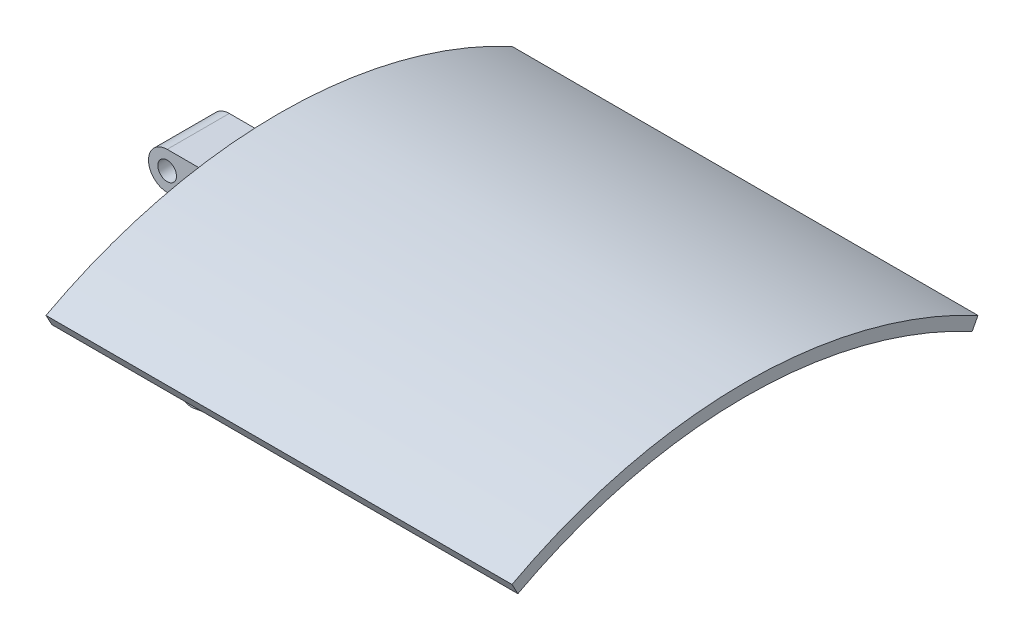
ISO-10303-21;
HEADER;
FILE_DESCRIPTION(('STEP AP214'),'2;1');
FILE_NAME('part.step','',(''),(''),'','','');
FILE_SCHEMA(('AUTOMOTIVE_DESIGN { 1 0 10303 214 1 1 1 1 }'));
ENDSEC;
DATA;
#1=APPLICATION_CONTEXT('core data for automotive mechanical design processes');
#2=APPLICATION_PROTOCOL_DEFINITION('international standard','automotive_design',2000,#1);
#3=PRODUCT_CONTEXT('',#1,'mechanical');
#4=PRODUCT('Part','Part','',(#3));
#5=PRODUCT_RELATED_PRODUCT_CATEGORY('part','',(#4));
#6=PRODUCT_DEFINITION_FORMATION('','',#4);
#7=PRODUCT_DEFINITION_CONTEXT('part definition',#1,'design');
#8=PRODUCT_DEFINITION('design','',#6,#7);
#9=PRODUCT_DEFINITION_SHAPE('','',#8);
#10=(LENGTH_UNIT() NAMED_UNIT(*) SI_UNIT(.MILLI.,.METRE.));
#11=(NAMED_UNIT(*) PLANE_ANGLE_UNIT() SI_UNIT($,.RADIAN.));
#12=(NAMED_UNIT(*) SI_UNIT($,.STERADIAN.) SOLID_ANGLE_UNIT());
#13=UNCERTAINTY_MEASURE_WITH_UNIT(LENGTH_MEASURE(1.E-05),#10,'distance_accuracy_value','');
#14=(GEOMETRIC_REPRESENTATION_CONTEXT(3) GLOBAL_UNCERTAINTY_ASSIGNED_CONTEXT((#13)) GLOBAL_UNIT_ASSIGNED_CONTEXT((#10,
#11,#12)) REPRESENTATION_CONTEXT('',''));
#15=CARTESIAN_POINT('',(0.,0.,0.));
#16=DIRECTION('',(0.,0.,1.));
#17=DIRECTION('',(1.,0.,0.));
#18=AXIS2_PLACEMENT_3D('',#15,#16,#17);
#19=CARTESIAN_POINT('',(75.,0.,0.));
#20=DIRECTION('',(-1.,0.,0.));
#21=DIRECTION('',(0.,0.,1.));
#22=AXIS2_PLACEMENT_3D('',#19,#20,#21);
#23=CYLINDRICAL_SURFACE('',#22,77.5);
#24=DIRECTION('',(-1.,0.,0.));
#25=VECTOR('',#24,1.);
#26=CARTESIAN_POINT('',(75.,77.3385414912901,-5.));
#27=LINE('',#26,#25);
#28=CARTESIAN_POINT('',(7.,77.3385414912901,-5.));
#29=VERTEX_POINT('',#28);
#30=CARTESIAN_POINT('',(13.,77.3385414912901,-5.));
#31=VERTEX_POINT('',#30);
#32=EDGE_CURVE('E404',#29,#31,#27,.F.);
#33=ORIENTED_EDGE('',*,*,#32,.F.);
#34=CARTESIAN_POINT('',(7.00000000000001,0.,0.));
#35=DIRECTION('',(-1.,0.,0.));
#36=DIRECTION('',(0.,-1.,0.));
#37=AXIS2_PLACEMENT_3D('',#34,#35,#36);
#38=CIRCLE('',#37,77.5);
#39=CARTESIAN_POINT('',(7.,77.3385414912901,5.));
#40=VERTEX_POINT('',#39);
#41=EDGE_CURVE('E401',#29,#40,#38,.F.);
#42=ORIENTED_EDGE('',*,*,#41,.T.);
#43=DIRECTION('',(-1.,0.,0.));
#44=VECTOR('',#43,1.);
#45=CARTESIAN_POINT('',(75.,77.3385414912901,5.));
#46=LINE('',#45,#44);
#47=CARTESIAN_POINT('',(13.,77.3385414912901,5.));
#48=VERTEX_POINT('',#47);
#49=EDGE_CURVE('E396',#40,#48,#46,.F.);
#50=ORIENTED_EDGE('',*,*,#49,.T.);
#51=CARTESIAN_POINT('',(13.,0.,0.));
#52=DIRECTION('',(-1.,0.,0.));
#53=DIRECTION('',(0.,-1.,0.));
#54=AXIS2_PLACEMENT_3D('',#51,#52,#53);
#55=CIRCLE('',#54,77.5);
#56=EDGE_CURVE('E399',#31,#48,#55,.F.);
#57=ORIENTED_EDGE('',*,*,#56,.F.);
#58=EDGE_LOOP('',(#33,#42,#50,#57));
#59=FACE_BOUND('',#58,.T.);
#60=CARTESIAN_POINT('',(0.,0.,0.));
#61=DIRECTION('',(-1.,0.,0.));
#62=DIRECTION('',(0.,0.,1.));
#63=AXIS2_PLACEMENT_3D('',#60,#61,#62);
#64=CIRCLE('',#63,77.5);
#65=CARTESIAN_POINT('',(0.,68.3364084550916,36.5566037735849));
#66=VERTEX_POINT('',#65);
#67=CARTESIAN_POINT('',(0.,68.3364084550916,-36.5566037735849));
#68=VERTEX_POINT('',#67);
#69=EDGE_CURVE('E373',#66,#68,#64,.T.);
#70=ORIENTED_EDGE('',*,*,#69,.T.);
#71=DIRECTION('',(-1.,0.,0.));
#72=VECTOR('',#71,1.);
#73=CARTESIAN_POINT('',(75.,68.3364084550916,-36.5566037735849));
#74=LINE('',#73,#72);
#75=CARTESIAN_POINT('',(75.,68.3364084550916,-36.5566037735849));
#76=VERTEX_POINT('',#75);
#77=EDGE_CURVE('E381',#76,#68,#74,.T.);
#78=ORIENTED_EDGE('',*,*,#77,.F.);
#79=CARTESIAN_POINT('',(75.,0.,0.));
#80=DIRECTION('',(-1.,0.,0.));
#81=DIRECTION('',(0.,0.,1.));
#82=AXIS2_PLACEMENT_3D('',#79,#80,#81);
#83=CIRCLE('',#82,77.5);
#84=CARTESIAN_POINT('',(75.,68.3364084550916,36.5566037735849));
#85=VERTEX_POINT('',#84);
#86=EDGE_CURVE('E380',#85,#76,#83,.T.);
#87=ORIENTED_EDGE('',*,*,#86,.F.);
#88=DIRECTION('',(-1.,0.,0.));
#89=VECTOR('',#88,1.);
#90=CARTESIAN_POINT('',(75.,68.3364084550916,36.5566037735849));
#91=LINE('',#90,#89);
#92=EDGE_CURVE('E366',#85,#66,#91,.T.);
#93=ORIENTED_EDGE('',*,*,#92,.T.);
#94=EDGE_LOOP('',(#70,#78,#87,#93));
#95=FACE_BOUND('',#94,.T.);
#96=DIRECTION('',(-1.,0.,0.));
#97=VECTOR('',#96,1.);
#98=CARTESIAN_POINT('',(75.,77.4419137160233,-3.));
#99=LINE('',#98,#97);
#100=CARTESIAN_POINT('',(30.7213595499958,77.4419137160233,-3.));
#101=VERTEX_POINT('',#100);
#102=CARTESIAN_POINT('',(36.7213595499958,77.4419137160233,-3.));
#103=VERTEX_POINT('',#102);
#104=EDGE_CURVE('E12',#101,#103,#99,.F.);
#105=ORIENTED_EDGE('',*,*,#104,.F.);
#106=CARTESIAN_POINT('',(30.7213595499957,0.,0.));
#107=DIRECTION('',(-1.,0.,0.));
#108=DIRECTION('',(0.,-1.,0.));
#109=AXIS2_PLACEMENT_3D('',#106,#107,#108);
#110=CIRCLE('',#109,77.5);
#111=CARTESIAN_POINT('',(30.7213595499958,77.4419137160233,3.));
#112=VERTEX_POINT('',#111);
#113=EDGE_CURVE('E145',#101,#112,#110,.F.);
#114=ORIENTED_EDGE('',*,*,#113,.T.);
#115=DIRECTION('',(-1.,0.,0.));
#116=VECTOR('',#115,1.);
#117=CARTESIAN_POINT('',(75.,77.4419137160233,3.));
#118=LINE('',#117,#116);
#119=CARTESIAN_POINT('',(36.7213595499958,77.4419137160233,3.));
#120=VERTEX_POINT('',#119);
#121=EDGE_CURVE('E407',#112,#120,#118,.F.);
#122=ORIENTED_EDGE('',*,*,#121,.T.);
#123=CARTESIAN_POINT('',(36.721359549996,0.,0.));
#124=DIRECTION('',(1.,0.,0.));
#125=DIRECTION('',(0.,1.,0.));
#126=AXIS2_PLACEMENT_3D('',#123,#124,#125);
#127=CIRCLE('',#126,77.5);
#128=EDGE_CURVE('E410',#120,#103,#127,.F.);
#129=ORIENTED_EDGE('',*,*,#128,.T.);
#130=EDGE_LOOP('',(#105,#114,#122,#129));
#131=FACE_BOUND('',#130,.T.);
#132=ADVANCED_FACE('F137',(#59,#95,#131),#23,.F.);
#133=CARTESIAN_POINT('',(75.,0.,0.));
#134=DIRECTION('',(-1.,0.,0.));
#135=DIRECTION('',(0.,0.,1.));
#136=AXIS2_PLACEMENT_3D('',#133,#134,#135);
#137=CYLINDRICAL_SURFACE('',#136,79.5);
#138=CARTESIAN_POINT('',(0.,0.,0.));
#139=DIRECTION('',(1.,0.,0.));
#140=DIRECTION('',(0.,0.,1.));
#141=AXIS2_PLACEMENT_3D('',#138,#139,#140);
#142=CIRCLE('',#141,79.5);
#143=CARTESIAN_POINT('',(0.,70.0999286732875,-37.5));
#144=VERTEX_POINT('',#143);
#145=CARTESIAN_POINT('',(0.,70.0999286732875,37.5));
#146=VERTEX_POINT('',#145);
#147=EDGE_CURVE('E374',#144,#146,#142,.T.);
#148=ORIENTED_EDGE('',*,*,#147,.T.);
#149=DIRECTION('',(-1.,0.,0.));
#150=VECTOR('',#149,1.);
#151=CARTESIAN_POINT('',(75.,70.0999286732875,37.5));
#152=LINE('',#151,#150);
#153=CARTESIAN_POINT('',(75.,70.0999286732875,37.5));
#154=VERTEX_POINT('',#153);
#155=EDGE_CURVE('E369',#154,#146,#152,.T.);
#156=ORIENTED_EDGE('',*,*,#155,.F.);
#157=CARTESIAN_POINT('',(75.,0.,0.));
#158=DIRECTION('',(1.,0.,0.));
#159=DIRECTION('',(0.,0.,1.));
#160=AXIS2_PLACEMENT_3D('',#157,#158,#159);
#161=CIRCLE('',#160,79.5);
#162=CARTESIAN_POINT('',(75.,70.0999286732875,-37.5));
#163=VERTEX_POINT('',#162);
#164=EDGE_CURVE('E386',#163,#154,#161,.T.);
#165=ORIENTED_EDGE('',*,*,#164,.F.);
#166=DIRECTION('',(-1.,0.,0.));
#167=VECTOR('',#166,1.);
#168=CARTESIAN_POINT('',(75.,70.0999286732875,-37.5));
#169=LINE('',#168,#167);
#170=EDGE_CURVE('E390',#163,#144,#169,.T.);
#171=ORIENTED_EDGE('',*,*,#170,.T.);
#172=EDGE_LOOP('',(#148,#156,#165,#171));
#173=FACE_BOUND('',#172,.T.);
#174=ADVANCED_FACE('F139',(#173),#137,.T.);
#175=CARTESIAN_POINT('',(75.,70.0999286732875,37.5));
#176=DIRECTION('',(0.,0.471698113207548,-0.881760109097956));
#177=DIRECTION('',(0.,0.881760109097956,0.471698113207548));
#178=AXIS2_PLACEMENT_3D('',#175,#176,#177);
#179=PLANE('',#178);
#180=DIRECTION('',(0.,-0.881760109097956,-0.471698113207548));
#181=VECTOR('',#180,1.);
#182=CARTESIAN_POINT('',(0.,70.0999286732875,37.5));
#183=LINE('',#182,#181);
#184=EDGE_CURVE('E364',#146,#66,#183,.T.);
#185=ORIENTED_EDGE('',*,*,#184,.T.);
#186=ORIENTED_EDGE('',*,*,#92,.F.);
#187=DIRECTION('',(0.,-0.881760109097956,-0.471698113207548));
#188=VECTOR('',#187,1.);
#189=CARTESIAN_POINT('',(75.,70.0999286732875,37.5));
#190=LINE('',#189,#188);
#191=EDGE_CURVE('E478',#154,#85,#190,.T.);
#192=ORIENTED_EDGE('',*,*,#191,.F.);
#193=ORIENTED_EDGE('',*,*,#155,.T.);
#194=EDGE_LOOP('',(#185,#186,#192,#193));
#195=FACE_BOUND('',#194,.T.);
#196=ADVANCED_FACE('F352',(#195),#179,.F.);
#197=CARTESIAN_POINT('',(75.,70.0999286732875,-37.5));
#198=DIRECTION('',(0.,0.471698113207551,0.881760109097955));
#199=DIRECTION('',(0.,-0.881760109097955,0.471698113207551));
#200=AXIS2_PLACEMENT_3D('',#197,#198,#199);
#201=PLANE('',#200);
#202=DIRECTION('',(0.,0.881760109097955,-0.471698113207551));
#203=VECTOR('',#202,1.);
#204=CARTESIAN_POINT('',(0.,70.0999286732875,-37.5));
#205=LINE('',#204,#203);
#206=EDGE_CURVE('E384',#68,#144,#205,.T.);
#207=ORIENTED_EDGE('',*,*,#206,.T.);
#208=ORIENTED_EDGE('',*,*,#170,.F.);
#209=DIRECTION('',(0.,0.881760109097955,-0.471698113207551));
#210=VECTOR('',#209,1.);
#211=CARTESIAN_POINT('',(75.,70.0999286732875,-37.5));
#212=LINE('',#211,#210);
#213=EDGE_CURVE('E393',#76,#163,#212,.T.);
#214=ORIENTED_EDGE('',*,*,#213,.F.);
#215=ORIENTED_EDGE('',*,*,#77,.T.);
#216=EDGE_LOOP('',(#207,#208,#214,#215));
#217=FACE_BOUND('',#216,.T.);
#218=ADVANCED_FACE('F345',(#217),#201,.F.);
#219=CARTESIAN_POINT('',(75.,0.,0.));
#220=DIRECTION('',(-1.,0.,0.));
#221=DIRECTION('',(0.,0.,1.));
#222=AXIS2_PLACEMENT_3D('',#219,#220,#221);
#223=PLANE('',#222);
#224=ORIENTED_EDGE('',*,*,#164,.T.);
#225=ORIENTED_EDGE('',*,*,#191,.T.);
#226=ORIENTED_EDGE('',*,*,#86,.T.);
#227=ORIENTED_EDGE('',*,*,#213,.T.);
#228=EDGE_LOOP('',(#224,#225,#226,#227));
#229=FACE_BOUND('',#228,.T.);
#230=ADVANCED_FACE('F342',(#229),#223,.F.);
#231=CARTESIAN_POINT('',(0.,0.,0.));
#232=DIRECTION('',(-1.,0.,0.));
#233=DIRECTION('',(0.,0.,1.));
#234=AXIS2_PLACEMENT_3D('',#231,#232,#233);
#235=PLANE('',#234);
#236=ORIENTED_EDGE('',*,*,#147,.F.);
#237=ORIENTED_EDGE('',*,*,#206,.F.);
#238=ORIENTED_EDGE('',*,*,#69,.F.);
#239=ORIENTED_EDGE('',*,*,#184,.F.);
#240=EDGE_LOOP('',(#236,#237,#238,#239));
#241=FACE_BOUND('',#240,.T.);
#242=ADVANCED_FACE('F331',(#241),#235,.T.);
#243=CARTESIAN_POINT('',(7.,77.5,-5.));
#244=DIRECTION('',(-1.,0.,0.));
#245=DIRECTION('',(0.,-1.,0.));
#246=AXIS2_PLACEMENT_3D('',#243,#244,#245);
#247=PLANE('',#246);
#248=ORIENTED_EDGE('',*,*,#41,.F.);
#249=DIRECTION('',(0.,-1.,0.));
#250=VECTOR('',#249,1.);
#251=CARTESIAN_POINT('',(7.,77.5,-5.));
#252=LINE('',#251,#250);
#253=CARTESIAN_POINT('',(7.,70.5,-5.));
#254=VERTEX_POINT('',#253);
#255=EDGE_CURVE('E461',#29,#254,#252,.T.);
#256=ORIENTED_EDGE('',*,*,#255,.T.);
#257=DIRECTION('',(0.,0.,1.));
#258=VECTOR('',#257,1.);
#259=CARTESIAN_POINT('',(7.,70.5,-5.));
#260=LINE('',#259,#258);
#261=CARTESIAN_POINT('',(7.,70.5,5.));
#262=VERTEX_POINT('',#261);
#263=EDGE_CURVE('E469',#254,#262,#260,.T.);
#264=ORIENTED_EDGE('',*,*,#263,.T.);
#265=DIRECTION('',(0.,-1.,0.));
#266=VECTOR('',#265,1.);
#267=CARTESIAN_POINT('',(7.,77.5,5.));
#268=LINE('',#267,#266);
#269=EDGE_CURVE('E446',#40,#262,#268,.T.);
#270=ORIENTED_EDGE('',*,*,#269,.F.);
#271=EDGE_LOOP('',(#248,#256,#264,#270));
#272=FACE_BOUND('',#271,.T.);
#273=ADVANCED_FACE('F328',(#272),#247,.T.);
#274=CARTESIAN_POINT('',(13.,77.5,-5.));
#275=DIRECTION('',(-1.,0.,0.));
#276=DIRECTION('',(0.,-1.,0.));
#277=AXIS2_PLACEMENT_3D('',#274,#275,#276);
#278=PLANE('',#277);
#279=DIRECTION('',(0.,-1.,0.));
#280=VECTOR('',#279,1.);
#281=CARTESIAN_POINT('',(13.,77.5,-5.));
#282=LINE('',#281,#280);
#283=CARTESIAN_POINT('',(13.,64.5,-5.));
#284=VERTEX_POINT('',#283);
#285=EDGE_CURVE('E459',#31,#284,#282,.T.);
#286=ORIENTED_EDGE('',*,*,#285,.F.);
#287=ORIENTED_EDGE('',*,*,#56,.T.);
#288=DIRECTION('',(0.,-1.,0.));
#289=VECTOR('',#288,1.);
#290=CARTESIAN_POINT('',(13.,77.5,5.));
#291=LINE('',#290,#289);
#292=CARTESIAN_POINT('',(13.,64.5,5.));
#293=VERTEX_POINT('',#292);
#294=EDGE_CURVE('E160',#48,#293,#291,.T.);
#295=ORIENTED_EDGE('',*,*,#294,.T.);
#296=DIRECTION('',(0.,0.,1.));
#297=VECTOR('',#296,1.);
#298=CARTESIAN_POINT('',(13.,64.5,-5.));
#299=LINE('',#298,#297);
#300=EDGE_CURVE('E472',#284,#293,#299,.T.);
#301=ORIENTED_EDGE('',*,*,#300,.F.);
#302=EDGE_LOOP('',(#286,#287,#295,#301));
#303=FACE_BOUND('',#302,.T.);
#304=ADVANCED_FACE('F322',(#303),#278,.F.);
#305=CARTESIAN_POINT('',(-13.,67.5,-5.));
#306=DIRECTION('',(0.,0.,1.));
#307=DIRECTION('',(1.,0.,0.));
#308=AXIS2_PLACEMENT_3D('',#305,#306,#307);
#309=PLANE('',#308);
#310=CARTESIAN_POINT('',(-13.,67.5,-5.));
#311=DIRECTION('',(0.,0.,1.));
#312=DIRECTION('',(1.,0.,0.));
#313=AXIS2_PLACEMENT_3D('',#310,#311,#312);
#314=CIRCLE('',#313,1.5);
#315=CARTESIAN_POINT('',(-11.5,67.5,-5.));
#316=VERTEX_POINT('',#315);
#317=EDGE_CURVE('E451',#316,#316,#314,.T.);
#318=ORIENTED_EDGE('',*,*,#317,.T.);
#319=EDGE_LOOP('',(#318));
#320=FACE_BOUND('',#319,.T.);
#321=ORIENTED_EDGE('',*,*,#255,.F.);
#322=ORIENTED_EDGE('',*,*,#32,.T.);
#323=ORIENTED_EDGE('',*,*,#285,.T.);
#324=DIRECTION('',(-1.,0.,0.));
#325=VECTOR('',#324,1.);
#326=CARTESIAN_POINT('',(13.,64.5,-5.));
#327=LINE('',#326,#325);
#328=CARTESIAN_POINT('',(-13.,64.5,-5.));
#329=VERTEX_POINT('',#328);
#330=EDGE_CURVE('E457',#284,#329,#327,.T.);
#331=ORIENTED_EDGE('',*,*,#330,.T.);
#332=CARTESIAN_POINT('',(-13.,67.5,-5.));
#333=DIRECTION('',(0.,0.,1.));
#334=DIRECTION('',(1.,0.,0.));
#335=AXIS2_PLACEMENT_3D('',#332,#333,#334);
#336=CIRCLE('',#335,3.);
#337=CARTESIAN_POINT('',(-13.,70.5,-5.));
#338=VERTEX_POINT('',#337);
#339=EDGE_CURVE('E454',#338,#329,#336,.T.);
#340=ORIENTED_EDGE('',*,*,#339,.F.);
#341=DIRECTION('',(1.,0.,0.));
#342=VECTOR('',#341,1.);
#343=CARTESIAN_POINT('',(-13.,70.5,-5.));
#344=LINE('',#343,#342);
#345=EDGE_CURVE('E463',#338,#254,#344,.T.);
#346=ORIENTED_EDGE('',*,*,#345,.T.);
#347=EDGE_LOOP('',(#321,#322,#323,#331,#340,#346));
#348=FACE_BOUND('',#347,.T.);
#349=ADVANCED_FACE('F312',(#320,#348),#309,.F.);
#350=CARTESIAN_POINT('',(-13.,67.5,5.));
#351=DIRECTION('',(0.,0.,1.));
#352=DIRECTION('',(1.,0.,0.));
#353=AXIS2_PLACEMENT_3D('',#350,#351,#352);
#354=PLANE('',#353);
#355=CARTESIAN_POINT('',(-13.,67.5,5.));
#356=DIRECTION('',(0.,0.,1.));
#357=DIRECTION('',(1.,0.,0.));
#358=AXIS2_PLACEMENT_3D('',#355,#356,#357);
#359=CIRCLE('',#358,1.5);
#360=CARTESIAN_POINT('',(-11.5,67.5,5.));
#361=VERTEX_POINT('',#360);
#362=EDGE_CURVE('E261',#361,#361,#359,.T.);
#363=ORIENTED_EDGE('',*,*,#362,.F.);
#364=EDGE_LOOP('',(#363));
#365=FACE_BOUND('',#364,.T.);
#366=ORIENTED_EDGE('',*,*,#49,.F.);
#367=ORIENTED_EDGE('',*,*,#269,.T.);
#368=DIRECTION('',(1.,0.,0.));
#369=VECTOR('',#368,1.);
#370=CARTESIAN_POINT('',(-13.,70.5,5.));
#371=LINE('',#370,#369);
#372=CARTESIAN_POINT('',(-13.,70.5,5.));
#373=VERTEX_POINT('',#372);
#374=EDGE_CURVE('E448',#373,#262,#371,.T.);
#375=ORIENTED_EDGE('',*,*,#374,.F.);
#376=CARTESIAN_POINT('',(-13.,67.5,5.));
#377=DIRECTION('',(0.,0.,1.));
#378=DIRECTION('',(1.,0.,0.));
#379=AXIS2_PLACEMENT_3D('',#376,#377,#378);
#380=CIRCLE('',#379,3.);
#381=CARTESIAN_POINT('',(-13.,64.5,5.));
#382=VERTEX_POINT('',#381);
#383=EDGE_CURVE('E439',#373,#382,#380,.T.);
#384=ORIENTED_EDGE('',*,*,#383,.T.);
#385=DIRECTION('',(-1.,0.,0.));
#386=VECTOR('',#385,1.);
#387=CARTESIAN_POINT('',(13.,64.5,5.));
#388=LINE('',#387,#386);
#389=EDGE_CURVE('E442',#293,#382,#388,.T.);
#390=ORIENTED_EDGE('',*,*,#389,.F.);
#391=ORIENTED_EDGE('',*,*,#294,.F.);
#392=EDGE_LOOP('',(#366,#367,#375,#384,#390,#391));
#393=FACE_BOUND('',#392,.T.);
#394=ADVANCED_FACE('F308',(#365,#393),#354,.T.);
#395=CARTESIAN_POINT('',(-13.,67.5,-5.));
#396=DIRECTION('',(0.,0.,1.));
#397=DIRECTION('',(1.,0.,0.));
#398=AXIS2_PLACEMENT_3D('',#395,#396,#397);
#399=CYLINDRICAL_SURFACE('',#398,3.);
#400=DIRECTION('',(0.,0.,1.));
#401=VECTOR('',#400,1.);
#402=CARTESIAN_POINT('',(-13.,64.5,-5.));
#403=LINE('',#402,#401);
#404=EDGE_CURVE('E466',#329,#382,#403,.T.);
#405=ORIENTED_EDGE('',*,*,#404,.T.);
#406=ORIENTED_EDGE('',*,*,#383,.F.);
#407=DIRECTION('',(0.,0.,1.));
#408=VECTOR('',#407,1.);
#409=CARTESIAN_POINT('',(-13.,70.5,-5.));
#410=LINE('',#409,#408);
#411=EDGE_CURVE('E467',#338,#373,#410,.T.);
#412=ORIENTED_EDGE('',*,*,#411,.F.);
#413=ORIENTED_EDGE('',*,*,#339,.T.);
#414=EDGE_LOOP('',(#405,#406,#412,#413));
#415=FACE_BOUND('',#414,.T.);
#416=ADVANCED_FACE('F311',(#415),#399,.T.);
#417=CARTESIAN_POINT('',(-13.,70.5,-5.));
#418=DIRECTION('',(0.,-1.,0.));
#419=DIRECTION('',(0.,0.,-1.));
#420=AXIS2_PLACEMENT_3D('',#417,#418,#419);
#421=PLANE('',#420);
#422=ORIENTED_EDGE('',*,*,#411,.T.);
#423=ORIENTED_EDGE('',*,*,#374,.T.);
#424=ORIENTED_EDGE('',*,*,#263,.F.);
#425=ORIENTED_EDGE('',*,*,#345,.F.);
#426=EDGE_LOOP('',(#422,#423,#424,#425));
#427=FACE_BOUND('',#426,.T.);
#428=ADVANCED_FACE('F324',(#427),#421,.F.);
#429=CARTESIAN_POINT('',(13.,64.5,-5.));
#430=DIRECTION('',(0.,1.,0.));
#431=DIRECTION('',(0.,0.,1.));
#432=AXIS2_PLACEMENT_3D('',#429,#430,#431);
#433=PLANE('',#432);
#434=ORIENTED_EDGE('',*,*,#300,.T.);
#435=ORIENTED_EDGE('',*,*,#389,.T.);
#436=ORIENTED_EDGE('',*,*,#404,.F.);
#437=ORIENTED_EDGE('',*,*,#330,.F.);
#438=EDGE_LOOP('',(#434,#435,#436,#437));
#439=FACE_BOUND('',#438,.T.);
#440=ADVANCED_FACE('F318',(#439),#433,.F.);
#441=CARTESIAN_POINT('',(-13.,67.5,-5.));
#442=DIRECTION('',(0.,0.,1.));
#443=DIRECTION('',(1.,0.,0.));
#444=AXIS2_PLACEMENT_3D('',#441,#442,#443);
#445=CYLINDRICAL_SURFACE('',#444,1.5);
#446=ORIENTED_EDGE('',*,*,#317,.F.);
#447=EDGE_LOOP('',(#446));
#448=FACE_BOUND('',#447,.T.);
#449=ORIENTED_EDGE('',*,*,#362,.T.);
#450=EDGE_LOOP('',(#449));
#451=FACE_BOUND('',#450,.T.);
#452=ADVANCED_FACE('F314',(#448,#451),#445,.F.);
#453=CARTESIAN_POINT('',(30.7213595499958,77.5,-3.));
#454=DIRECTION('',(-1.,0.,0.));
#455=DIRECTION('',(0.,-1.,0.));
#456=AXIS2_PLACEMENT_3D('',#453,#454,#455);
#457=PLANE('',#456);
#458=ORIENTED_EDGE('',*,*,#113,.F.);
#459=DIRECTION('',(0.,-1.,0.));
#460=VECTOR('',#459,1.);
#461=CARTESIAN_POINT('',(30.7213595499958,77.5,-3.));
#462=LINE('',#461,#460);
#463=CARTESIAN_POINT('',(30.7213595499958,72.5,-3.));
#464=VERTEX_POINT('',#463);
#465=EDGE_CURVE('E417',#101,#464,#462,.T.);
#466=ORIENTED_EDGE('',*,*,#465,.T.);
#467=DIRECTION('',(0.,0.,1.));
#468=VECTOR('',#467,1.);
#469=CARTESIAN_POINT('',(30.7213595499958,72.5,-3.));
#470=LINE('',#469,#468);
#471=CARTESIAN_POINT('',(30.7213595499958,72.5,3.));
#472=VERTEX_POINT('',#471);
#473=EDGE_CURVE('E434',#464,#472,#470,.T.);
#474=ORIENTED_EDGE('',*,*,#473,.T.);
#475=DIRECTION('',(0.,-1.,0.));
#476=VECTOR('',#475,1.);
#477=CARTESIAN_POINT('',(30.7213595499958,77.5,3.));
#478=LINE('',#477,#476);
#479=EDGE_CURVE('E285',#112,#472,#478,.T.);
#480=ORIENTED_EDGE('',*,*,#479,.F.);
#481=EDGE_LOOP('',(#458,#466,#474,#480));
#482=FACE_BOUND('',#481,.T.);
#483=ADVANCED_FACE('F317',(#482),#457,.T.);
#484=CARTESIAN_POINT('',(36.7213595499958,72.5,-3.));
#485=DIRECTION('',(1.,0.,0.));
#486=DIRECTION('',(0.,1.,0.));
#487=AXIS2_PLACEMENT_3D('',#484,#485,#486);
#488=PLANE('',#487);
#489=DIRECTION('',(0.,1.,0.));
#490=VECTOR('',#489,1.);
#491=CARTESIAN_POINT('',(36.7213595499958,72.5,-3.));
#492=LINE('',#491,#490);
#493=CARTESIAN_POINT('',(36.7213595499958,72.5,-3.));
#494=VERTEX_POINT('',#493);
#495=EDGE_CURVE('E426',#494,#103,#492,.T.);
#496=ORIENTED_EDGE('',*,*,#495,.T.);
#497=ORIENTED_EDGE('',*,*,#128,.F.);
#498=DIRECTION('',(0.,1.,0.));
#499=VECTOR('',#498,1.);
#500=CARTESIAN_POINT('',(36.7213595499958,72.5,3.));
#501=LINE('',#500,#499);
#502=CARTESIAN_POINT('',(36.7213595499958,72.5,3.));
#503=VERTEX_POINT('',#502);
#504=EDGE_CURVE('E152',#503,#120,#501,.T.);
#505=ORIENTED_EDGE('',*,*,#504,.F.);
#506=DIRECTION('',(0.,0.,1.));
#507=VECTOR('',#506,1.);
#508=CARTESIAN_POINT('',(36.7213595499958,72.5,-3.));
#509=LINE('',#508,#507);
#510=EDGE_CURVE('E271',#494,#503,#509,.T.);
#511=ORIENTED_EDGE('',*,*,#510,.F.);
#512=EDGE_LOOP('',(#496,#497,#505,#511));
#513=FACE_BOUND('',#512,.T.);
#514=ADVANCED_FACE('F503',(#513),#488,.T.);
#515=CARTESIAN_POINT('',(27.6346513616699,44.4449933388761,-3.));
#516=DIRECTION('',(0.,0.,1.));
#517=DIRECTION('',(1.,0.,0.));
#518=AXIS2_PLACEMENT_3D('',#515,#516,#517);
#519=PLANE('',#518);
#520=CARTESIAN_POINT('',(-11.,37.5,-3.));
#521=DIRECTION('',(0.,0.,1.));
#522=DIRECTION('',(1.,0.,0.));
#523=AXIS2_PLACEMENT_3D('',#520,#521,#522);
#524=CIRCLE('',#523,1.5);
#525=CARTESIAN_POINT('',(-9.49999999999999,37.5,-3.));
#526=VERTEX_POINT('',#525);
#527=EDGE_CURVE('E291',#526,#526,#524,.T.);
#528=ORIENTED_EDGE('',*,*,#527,.T.);
#529=EDGE_LOOP('',(#528));
#530=FACE_BOUND('',#529,.T.);
#531=ORIENTED_EDGE('',*,*,#465,.F.);
#532=ORIENTED_EDGE('',*,*,#104,.T.);
#533=ORIENTED_EDGE('',*,*,#495,.F.);
#534=CARTESIAN_POINT('',(36.7213595499958,72.5,-3.));
#535=CARTESIAN_POINT('',(36.7213595499958,41.4065160958014,-3.));
#536=CARTESIAN_POINT('',(28.3972575644587,41.4467994745349,-3.));
#537=CARTESIAN_POINT('',(-11.0000000000001,34.5,-3.));
#538=B_SPLINE_CURVE_WITH_KNOTS('',3,(#534,#535,#536,#537),.UNSPECIFIED.,.F.,.F.,(4,4),(0.,1.),.UNSPECIFIED.);
#539=CARTESIAN_POINT('',(-11.,34.5,-3.));
#540=VERTEX_POINT('',#539);
#541=EDGE_CURVE('E294',#494,#540,#538,.T.);
#542=ORIENTED_EDGE('',*,*,#541,.T.);
#543=CARTESIAN_POINT('',(-11.,37.5,-3.));
#544=DIRECTION('',(0.,0.,1.));
#545=DIRECTION('',(1.,0.,0.));
#546=AXIS2_PLACEMENT_3D('',#543,#544,#545);
#547=CIRCLE('',#546,3.);
#548=CARTESIAN_POINT('',(-11.,40.5,-3.));
#549=VERTEX_POINT('',#548);
#550=EDGE_CURVE('E257',#549,#540,#547,.T.);
#551=ORIENTED_EDGE('',*,*,#550,.F.);
#552=CARTESIAN_POINT('',(30.7213595499958,72.5,-3.));
#553=CARTESIAN_POINT('',(30.7213595499958,44.6949637613059,-3.));
#554=CARTESIAN_POINT('',(24.9103531826161,46.8319641528654,-3.));
#555=CARTESIAN_POINT('',(-11.,40.5,-3.));
#556=B_SPLINE_CURVE_WITH_KNOTS('',3,(#552,#553,#554,#555),.UNSPECIFIED.,.F.,.F.,(4,4),(0.,1.),.UNSPECIFIED.);
#557=EDGE_CURVE('E425',#464,#549,#556,.T.);
#558=ORIENTED_EDGE('',*,*,#557,.F.);
#559=EDGE_LOOP('',(#531,#532,#533,#542,#551,#558));
#560=FACE_BOUND('',#559,.T.);
#561=ADVANCED_FACE('F421',(#530,#560),#519,.F.);
#562=CARTESIAN_POINT('',(27.6346513616699,44.4449933388761,3.));
#563=DIRECTION('',(0.,0.,1.));
#564=DIRECTION('',(1.,0.,0.));
#565=AXIS2_PLACEMENT_3D('',#562,#563,#564);
#566=PLANE('',#565);
#567=CARTESIAN_POINT('',(-11.,37.5,3.));
#568=DIRECTION('',(0.,0.,1.));
#569=DIRECTION('',(1.,0.,0.));
#570=AXIS2_PLACEMENT_3D('',#567,#568,#569);
#571=CIRCLE('',#570,1.5);
#572=CARTESIAN_POINT('',(-9.49999999999999,37.5,3.));
#573=VERTEX_POINT('',#572);
#574=EDGE_CURVE('E272',#573,#573,#571,.T.);
#575=ORIENTED_EDGE('',*,*,#574,.F.);
#576=EDGE_LOOP('',(#575));
#577=FACE_BOUND('',#576,.T.);
#578=ORIENTED_EDGE('',*,*,#121,.F.);
#579=ORIENTED_EDGE('',*,*,#479,.T.);
#580=CARTESIAN_POINT('',(30.7213595499958,72.5,3.));
#581=CARTESIAN_POINT('',(30.7213595499958,44.6949637613059,3.));
#582=CARTESIAN_POINT('',(24.9103531826161,46.8319641528654,3.));
#583=CARTESIAN_POINT('',(-11.,40.5,3.));
#584=B_SPLINE_CURVE_WITH_KNOTS('',3,(#580,#581,#582,#583),.UNSPECIFIED.,.F.,.F.,(4,4),(0.,1.),.UNSPECIFIED.);
#585=CARTESIAN_POINT('',(-11.,40.5,3.));
#586=VERTEX_POINT('',#585);
#587=EDGE_CURVE('E268',#472,#586,#584,.T.);
#588=ORIENTED_EDGE('',*,*,#587,.T.);
#589=CARTESIAN_POINT('',(-11.,37.5,3.));
#590=DIRECTION('',(0.,0.,1.));
#591=DIRECTION('',(1.,0.,0.));
#592=AXIS2_PLACEMENT_3D('',#589,#590,#591);
#593=CIRCLE('',#592,3.);
#594=CARTESIAN_POINT('',(-11.,34.5,3.));
#595=VERTEX_POINT('',#594);
#596=EDGE_CURVE('E255',#586,#595,#593,.T.);
#597=ORIENTED_EDGE('',*,*,#596,.T.);
#598=CARTESIAN_POINT('',(36.7213595499958,72.5,3.));
#599=CARTESIAN_POINT('',(36.7213595499958,41.4065160958014,3.));
#600=CARTESIAN_POINT('',(28.3972575644587,41.4467994745349,3.));
#601=CARTESIAN_POINT('',(-11.0000000000001,34.5,3.));
#602=B_SPLINE_CURVE_WITH_KNOTS('',3,(#598,#599,#600,#601),.UNSPECIFIED.,.F.,.F.,(4,4),(0.,1.),.UNSPECIFIED.);
#603=EDGE_CURVE('E266',#503,#595,#602,.T.);
#604=ORIENTED_EDGE('',*,*,#603,.F.);
#605=ORIENTED_EDGE('',*,*,#504,.T.);
#606=EDGE_LOOP('',(#578,#579,#588,#597,#604,#605));
#607=FACE_BOUND('',#606,.T.);
#608=ADVANCED_FACE('F265',(#577,#607),#566,.T.);
#609=DIRECTION('',(0.,0.,1.));
#610=VECTOR('',#609,1.);
#611=SURFACE_OF_LINEAR_EXTRUSION('',#538,#610);
#612=ORIENTED_EDGE('',*,*,#510,.T.);
#613=ORIENTED_EDGE('',*,*,#603,.T.);
#614=DIRECTION('',(0.,0.,1.));
#615=VECTOR('',#614,1.);
#616=CARTESIAN_POINT('',(-11.,34.5,-3.));
#617=LINE('',#616,#615);
#618=EDGE_CURVE('E252',#540,#595,#617,.T.);
#619=ORIENTED_EDGE('',*,*,#618,.F.);
#620=ORIENTED_EDGE('',*,*,#541,.F.);
#621=EDGE_LOOP('',(#612,#613,#619,#620));
#622=FACE_BOUND('',#621,.T.);
#623=ADVANCED_FACE('F270',(#622),#611,.F.);
#624=CARTESIAN_POINT('',(-11.,37.5,-3.));
#625=DIRECTION('',(0.,0.,1.));
#626=DIRECTION('',(1.,0.,0.));
#627=AXIS2_PLACEMENT_3D('',#624,#625,#626);
#628=CYLINDRICAL_SURFACE('',#627,3.);
#629=ORIENTED_EDGE('',*,*,#618,.T.);
#630=ORIENTED_EDGE('',*,*,#596,.F.);
#631=DIRECTION('',(0.,0.,1.));
#632=VECTOR('',#631,1.);
#633=CARTESIAN_POINT('',(-11.,40.5,-3.));
#634=LINE('',#633,#632);
#635=EDGE_CURVE('E262',#549,#586,#634,.T.);
#636=ORIENTED_EDGE('',*,*,#635,.F.);
#637=ORIENTED_EDGE('',*,*,#550,.T.);
#638=EDGE_LOOP('',(#629,#630,#636,#637));
#639=FACE_BOUND('',#638,.T.);
#640=ADVANCED_FACE('F254',(#639),#628,.T.);
#641=DIRECTION('',(0.,0.,1.));
#642=VECTOR('',#641,1.);
#643=SURFACE_OF_LINEAR_EXTRUSION('',#556,#642);
#644=ORIENTED_EDGE('',*,*,#635,.T.);
#645=ORIENTED_EDGE('',*,*,#587,.F.);
#646=ORIENTED_EDGE('',*,*,#473,.F.);
#647=ORIENTED_EDGE('',*,*,#557,.T.);
#648=EDGE_LOOP('',(#644,#645,#646,#647));
#649=FACE_BOUND('',#648,.T.);
#650=ADVANCED_FACE('F501',(#649),#643,.T.);
#651=CARTESIAN_POINT('',(-11.,37.5,-3.));
#652=DIRECTION('',(0.,0.,1.));
#653=DIRECTION('',(1.,0.,0.));
#654=AXIS2_PLACEMENT_3D('',#651,#652,#653);
#655=CYLINDRICAL_SURFACE('',#654,1.5);
#656=ORIENTED_EDGE('',*,*,#527,.F.);
#657=EDGE_LOOP('',(#656));
#658=FACE_BOUND('',#657,.T.);
#659=ORIENTED_EDGE('',*,*,#574,.T.);
#660=EDGE_LOOP('',(#659));
#661=FACE_BOUND('',#660,.T.);
#662=ADVANCED_FACE('F515',(#658,#661),#655,.F.);
#663=CLOSED_SHELL('',(#132,#174,#196,#218,#230,#242,#273,#304,#349,#394,#416,#428,#440,#452,
#483,#514,#561,#608,#623,#640,#650,#662));
#664=MANIFOLD_SOLID_BREP('B2',#663);
#665=ADVANCED_BREP_SHAPE_REPRESENTATION('',(#18,#664),#14);
#666=SHAPE_DEFINITION_REPRESENTATION(#9,#665);
ENDSEC;
END-ISO-10303-21;
